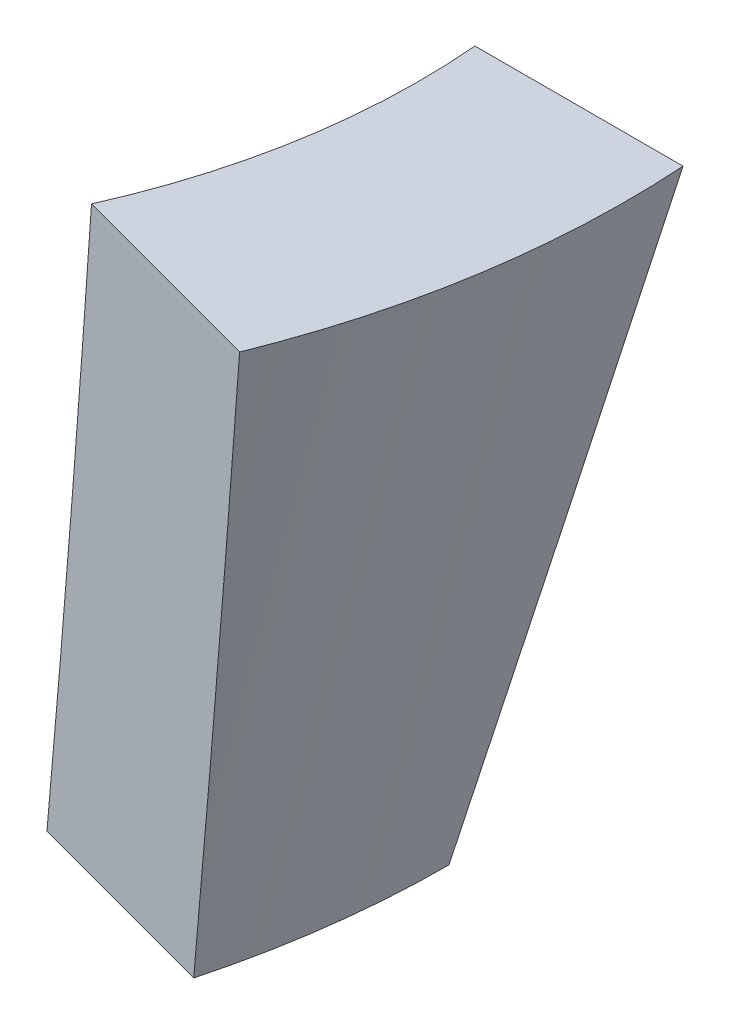
ISO-10303-21;
HEADER;
FILE_DESCRIPTION(('STEP AP214'),'2;1');
FILE_NAME('part.step','',(''),(''),'','','');
FILE_SCHEMA(('AUTOMOTIVE_DESIGN { 1 0 10303 214 1 1 1 1 }'));
ENDSEC;
DATA;
#1=APPLICATION_CONTEXT('core data for automotive mechanical design processes');
#2=APPLICATION_PROTOCOL_DEFINITION('international standard','automotive_design',2000,#1);
#3=PRODUCT_CONTEXT('',#1,'mechanical');
#4=PRODUCT('Part','Part','',(#3));
#5=PRODUCT_RELATED_PRODUCT_CATEGORY('part','',(#4));
#6=PRODUCT_DEFINITION_FORMATION('','',#4);
#7=PRODUCT_DEFINITION_CONTEXT('part definition',#1,'design');
#8=PRODUCT_DEFINITION('design','',#6,#7);
#9=PRODUCT_DEFINITION_SHAPE('','',#8);
#10=(LENGTH_UNIT() NAMED_UNIT(*) SI_UNIT(.MILLI.,.METRE.));
#11=(NAMED_UNIT(*) PLANE_ANGLE_UNIT() SI_UNIT($,.RADIAN.));
#12=(NAMED_UNIT(*) SI_UNIT($,.STERADIAN.) SOLID_ANGLE_UNIT());
#13=UNCERTAINTY_MEASURE_WITH_UNIT(LENGTH_MEASURE(1.E-05),#10,'distance_accuracy_value','');
#14=(GEOMETRIC_REPRESENTATION_CONTEXT(3) GLOBAL_UNCERTAINTY_ASSIGNED_CONTEXT((#13)) GLOBAL_UNIT_ASSIGNED_CONTEXT((#10,
#11,#12)) REPRESENTATION_CONTEXT('',''));
#15=CARTESIAN_POINT('',(0.,0.,0.));
#16=DIRECTION('',(0.,0.,1.));
#17=DIRECTION('',(1.,0.,0.));
#18=AXIS2_PLACEMENT_3D('',#15,#16,#17);
#19=CARTESIAN_POINT('',(21.4359353944896,80.,0.));
#20=DIRECTION('',(0.,1.,0.));
#21=DIRECTION('',(0.,0.,-1.));
#22=AXIS2_PLACEMENT_3D('',#19,#20,#21);
#23=CIRCLE('',#22,105.);
#24=DIRECTION('',(-0.258819045102518,-0.965925826289069,0.));
#25=VECTOR('',#24,1.);
#26=SURFACE_OF_LINEAR_EXTRUSION('',#23,#25);
#27=CARTESIAN_POINT('',(0.,0.,0.));
#28=DIRECTION('',(0.,1.,0.));
#29=DIRECTION('',(0.,0.,-1.));
#30=AXIS2_PLACEMENT_3D('',#27,#28,#29);
#31=CIRCLE('',#30,105.);
#32=CARTESIAN_POINT('',(101.422211760352,0.,27.1759997357646));
#33=VERTEX_POINT('',#32);
#34=CARTESIAN_POINT('',(105.,0.,0.));
#35=VERTEX_POINT('',#34);
#36=EDGE_CURVE('E100',#33,#35,#31,.T.);
#37=ORIENTED_EDGE('',*,*,#36,.T.);
#38=CARTESIAN_POINT('',(284.996412712619,760.461821769923,-66.5317884491401));
#39=CARTESIAN_POINT('',(283.950627110963,755.134162214118,-66.0656786348816));
#40=CARTESIAN_POINT('',(282.898399691684,749.807760474275,-65.5996788652606));
#41=CARTESIAN_POINT('',(280.781574157371,739.157399931895,-64.6678930553385));
#42=CARTESIAN_POINT('',(279.716976049185,733.833441128007,-64.2021070149193));
#43=CARTESIAN_POINT('',(276.505400993526,717.865149228456,-62.8050624978357));
#44=CARTESIAN_POINT('',(274.340635842155,707.224362613781,-61.8741142980533));
#45=CARTESIAN_POINT('',(269.967615093084,685.953872973423,-60.0131875868763));
#46=CARTESIAN_POINT('',(267.759368219562,675.324168165986,-59.0832089195986));
#47=CARTESIAN_POINT('',(263.3019218374,654.073275511207,-57.2239967224991));
#48=CARTESIAN_POINT('',(261.052722291262,643.452087671673,-56.2947631933605));
#49=CARTESIAN_POINT('',(256.516202763636,622.219239788182,-54.4371297091846));
#50=CARTESIAN_POINT('',(254.228887772484,611.607578685693,-53.5087296615378));
#51=CARTESIAN_POINT('',(249.618035021354,590.392068279631,-51.6526130100911));
#52=CARTESIAN_POINT('',(247.294497251187,579.788218978256,-50.7248964064835));
#53=CARTESIAN_POINT('',(242.613281388418,558.588898372392,-48.8701961790189));
#54=CARTESIAN_POINT('',(240.255606058711,547.993426462278,-47.9432125021765));
#55=CARTESIAN_POINT('',(235.507581734488,526.809751183298,-46.0898810634514));
#56=CARTESIAN_POINT('',(233.117232737602,516.221547814959,-45.1635333016147));
#57=CARTESIAN_POINT('',(228.305412509121,495.052659367242,-43.3114955429946));
#58=CARTESIAN_POINT('',(225.883942670744,484.471973973524,-42.3858055187099));
#59=CARTESIAN_POINT('',(221.011042314298,463.317448370055,-40.5350243461375));
#60=CARTESIAN_POINT('',(218.559611782506,452.743608163442,-39.6099331981242));
#61=CARTESIAN_POINT('',(213.627949943281,431.602785230563,-37.7603508538885));
#62=CARTESIAN_POINT('',(211.147719126793,421.035802390637,-36.8358596477219));
#63=CARTESIAN_POINT('',(206.159393330158,399.908364183198,-34.9874483152265));
#64=CARTESIAN_POINT('',(203.651298338163,389.347908818463,-34.0635281891407));
#65=CARTESIAN_POINT('',(196.086820911852,357.677276472663,-31.2927068921858));
#66=CARTESIAN_POINT('',(190.989976296407,336.576677853738,-29.446643719419));
#67=CARTESIAN_POINT('',(180.693956923978,294.399353646874,-25.756605993461));
#68=CARTESIAN_POINT('',(175.494777882414,273.322629097744,-23.9126315311535));
#69=CARTESIAN_POINT('',(164.998344188185,231.191964043945,-20.2266759521383));
#70=CARTESIAN_POINT('',(159.701083111475,210.138025127931,-18.3846949744197));
#71=CARTESIAN_POINT('',(149.011677443429,168.05211772346,-14.7026551823268));
#72=CARTESIAN_POINT('',(143.619524657483,147.020151300289,-12.8625965486415));
#73=CARTESIAN_POINT('',(135.461954093145,115.488833974811,-10.1039637366235));
#74=CARTESIAN_POINT('',(132.731059530806,104.980607000741,-9.18461300263512));
#75=CARTESIAN_POINT('',(127.246452935855,83.9700618909327,-7.34642849102684));
#76=CARTESIAN_POINT('',(124.492740902851,73.4677437552953,-6.42759471341585));
#77=CARTESIAN_POINT('',(118.962330560816,52.4677191919843,-4.59033063036019));
#78=CARTESIAN_POINT('',(116.185629434018,41.9700135008218,-3.6719003893519));
#79=CARTESIAN_POINT('',(110.609690025781,20.9805446156968,-1.83555980847334));
#80=CARTESIAN_POINT('',(107.810451746198,10.4887814212452,-0.917649468560272));
#81=CARTESIAN_POINT('',(105.,0.,0.));
#82=B_SPLINE_CURVE_WITH_KNOTS('',3,(#38,#39,#40,#41,#42,#43,#44,#45,#46,#47,#48,#49,#50,#51,#52,
#53,#54,#55,#56,#57,#58,#59,#60,#61,#62,#63,#64,#65,#66,#67,#68,#69,#70,#71,#72,#73,#74,#75,#76,
#77,#78,#79,#80,#81),.UNSPECIFIED.,.F.,.F.,(4,2,2,2,2,2,2,2,2,2,2,2,2,2,2,2,2,2,2,2,2,4),(0.,
16.3478942096739,32.6957793677583,65.3914329823252,98.08059206673,130.769781084149,
163.454723320819,196.13967475127,228.821995477614,261.504318575239,294.185183612275,
326.866063618559,359.546387343826,392.22672496503,457.583827994663,522.943673267928,
588.307814641591,653.677628670979,686.366022147782,719.05441618468,751.746877958596,
784.439337041124),.UNSPECIFIED.);
#83=CARTESIAN_POINT('',(126.20240281622,80.,-6.99909308207394));
#84=VERTEX_POINT('',#83);
#85=EDGE_CURVE('E11',#84,#35,#82,.T.);
#86=ORIENTED_EDGE('',*,*,#85,.F.);
#87=CARTESIAN_POINT('',(118.883985968629,80.,39.100862385631));
#88=VERTEX_POINT('',#87);
#89=EDGE_CURVE('E120',#88,#84,#23,.T.);
#90=ORIENTED_EDGE('',*,*,#89,.F.);
#91=CARTESIAN_POINT('',(118.883985968629,80.,39.100862385631));
#92=CARTESIAN_POINT('',(118.325095594337,77.3274521465327,38.7090423280245));
#93=CARTESIAN_POINT('',(117.763849538037,74.6554818422243,38.3166433788007));
#94=CARTESIAN_POINT('',(116.636678776635,69.3127328607252,37.530699771727));
#95=CARTESIAN_POINT('',(116.070754130813,66.6419541688869,37.1371551284345));
#96=CARTESIAN_POINT('',(114.93425011342,61.3015824603678,36.3489260042872));
#97=CARTESIAN_POINT('',(114.363670785723,58.6319894327602,35.9542415341993));
#98=CARTESIAN_POINT('',(113.217878535411,53.2939837590395,35.1637379389771));
#99=CARTESIAN_POINT('',(112.642665641666,50.6255711056806,34.7679188209227));
#100=CARTESIAN_POINT('',(111.487625399766,45.2899213950624,33.9751506250148));
#101=CARTESIAN_POINT('',(110.907798065818,42.6226843342104,33.5782015506427));
#102=CARTESIAN_POINT('',(109.743546053381,37.2893821195691,32.783177692541));
#103=CARTESIAN_POINT('',(109.159121375691,34.6233169655759,32.3851029090072));
#104=CARTESIAN_POINT('',(107.985689455567,29.2923540935908,31.5878311878498));
#105=CARTESIAN_POINT('',(107.396682198536,26.6274563793456,31.1886342466549));
#106=CARTESIAN_POINT('',(106.214097953585,21.2988250523751,30.3891213469766));
#107=CARTESIAN_POINT('',(105.620520936937,18.6350914470791,29.9888053814687));
#108=CARTESIAN_POINT('',(104.428808138554,13.3087854913733,29.1870571136083));
#109=CARTESIAN_POINT('',(103.830672314145,10.6462131520807,28.7856248008286));
#110=CARTESIAN_POINT('',(102.62985036912,5.32222751902937,27.9816459075423));
#111=CARTESIAN_POINT('',(102.027164192021,2.66081424009271,27.579099313244));
#112=CARTESIAN_POINT('',(101.422211760352,0.,27.1759997357647));
#113=B_SPLINE_CURVE_WITH_KNOTS('',3,(#91,#92,#93,#94,#95,#96,#97,#98,#99,#100,#101,#102,#103,
#104,#105,#106,#107,#108,#109,#110,#111,#112),.UNSPECIFIED.,.F.,.F.,(4,2,2,2,2,2,2,2,2,2,4),(0.,
8.27499371947538,16.5498827512979,24.8246938728032,33.09945347435,41.3741876100941,
49.6489203062983,57.923679367127,66.1984904884286,74.4733791609675,82.7483707152484),.UNSPECIFIED.);
#114=EDGE_CURVE('E107',#88,#33,#113,.T.);
#115=ORIENTED_EDGE('',*,*,#114,.T.);
#116=EDGE_LOOP('',(#37,#86,#90,#115));
#117=FACE_BOUND('',#116,.T.);
#118=ADVANCED_FACE('F44',(#117),#26,.F.);
#119=CARTESIAN_POINT('',(80.,0.,0.));
#120=DIRECTION('',(0.,-0.0871557427476584,-0.996194698091746));
#121=DIRECTION('',(0.,0.996194698091746,-0.0871557427476584));
#122=AXIS2_PLACEMENT_3D('',#119,#120,#121);
#123=PLANE('',#122);
#124=DIRECTION('',(-1.,0.,0.));
#125=VECTOR('',#124,1.);
#126=CARTESIAN_POINT('',(80.,0.,0.));
#127=LINE('',#126,#125);
#128=CARTESIAN_POINT('',(80.,0.,0.));
#129=VERTEX_POINT('',#128);
#130=EDGE_CURVE('E97',#35,#129,#127,.T.);
#131=ORIENTED_EDGE('',*,*,#130,.T.);
#132=CARTESIAN_POINT('',(101.129176613733,80.,-6.99909308207394));
#133=CARTESIAN_POINT('',(100.260806774325,76.6635234195996,-6.70718920516916));
#134=CARTESIAN_POINT('',(99.3909229710173,73.3274378887218,-6.41531954066449));
#135=CARTESIAN_POINT('',(97.6481396684642,66.6560572228062,-5.83164936233084));
#136=CARTESIAN_POINT('',(96.7752401764913,63.320762085883,-5.53984884833692));
#137=CARTESIAN_POINT('',(95.026434941116,56.650959755807,-4.95631675649647));
#138=CARTESIAN_POINT('',(94.1505292025223,53.316452561403,-4.66458517854049));
#139=CARTESIAN_POINT('',(92.3957194853498,46.6482240293872,-4.08119077618899));
#140=CARTESIAN_POINT('',(91.5168155091545,43.314502691153,-3.78952795173902));
#141=CARTESIAN_POINT('',(89.7560163186069,36.6478441078453,-3.2062709021018));
#142=CARTESIAN_POINT('',(88.8741211042932,33.3149068627617,-2.91467667691366));
#143=CARTESIAN_POINT('',(87.1073452625483,26.649814863093,-2.33155668558532));
#144=CARTESIAN_POINT('',(86.2224646327143,23.31766010914,-2.04003091950042));
#145=CARTESIAN_POINT('',(84.4497227957392,16.6541318148088,-1.4570477346622));
#146=CARTESIAN_POINT('',(83.5618615838298,13.3227582756896,-1.16559031601903));
#147=CARTESIAN_POINT('',(81.7831620532995,6.66079149234739,-0.58274374569032));
#148=CARTESIAN_POINT('',(80.8923237275605,3.33019825001051,-0.291354594169793));
#149=CARTESIAN_POINT('',(80.,0.,0.));
#150=B_SPLINE_CURVE_WITH_KNOTS('',3,(#132,#133,#134,#135,#136,#137,#138,#139,#140,#141,#142,
#143,#144,#145,#146,#147,#148,#149),.UNSPECIFIED.,.F.,.F.,(4,2,2,2,2,2,2,2,4),(0.,
10.3798912600029,20.7597575059986,31.1396071562676,41.5194485569093,51.899289823932,
62.279139447435,72.6590056845541,83.038896757264),.UNSPECIFIED.);
#151=CARTESIAN_POINT('',(101.129176613733,80.,-6.99909308207394));
#152=VERTEX_POINT('',#151);
#153=EDGE_CURVE('E49',#152,#129,#150,.T.);
#154=ORIENTED_EDGE('',*,*,#153,.F.);
#155=DIRECTION('',(1.,0.,0.));
#156=VECTOR('',#155,1.);
#157=CARTESIAN_POINT('',(21.4359353944896,80.,-6.99909308207394));
#158=LINE('',#157,#156);
#159=EDGE_CURVE('E78',#84,#152,#158,.F.);
#160=ORIENTED_EDGE('',*,*,#159,.F.);
#161=ORIENTED_EDGE('',*,*,#85,.T.);
#162=EDGE_LOOP('',(#131,#154,#160,#161));
#163=FACE_BOUND('',#162,.T.);
#164=ADVANCED_FACE('F46',(#163),#123,.T.);
#165=CARTESIAN_POINT('',(21.4359353944896,80.,0.));
#166=DIRECTION('',(0.,-1.,0.));
#167=DIRECTION('',(0.,0.,-1.));
#168=AXIS2_PLACEMENT_3D('',#165,#166,#167);
#169=CIRCLE('',#168,80.);
#170=DIRECTION('',(-0.258819045102518,-0.965925826289069,0.));
#171=VECTOR('',#170,1.);
#172=SURFACE_OF_LINEAR_EXTRUSION('',#169,#171);
#173=CARTESIAN_POINT('',(0.,0.,0.));
#174=DIRECTION('',(0.,-1.,0.));
#175=DIRECTION('',(0.,0.,-1.));
#176=AXIS2_PLACEMENT_3D('',#173,#174,#175);
#177=CIRCLE('',#176,80.);
#178=CARTESIAN_POINT('',(77.2740661031255,0.,20.7055236082016));
#179=VERTEX_POINT('',#178);
#180=EDGE_CURVE('E101',#129,#179,#177,.T.);
#181=ORIENTED_EDGE('',*,*,#180,.T.);
#182=CARTESIAN_POINT('',(77.2740661031254,0.,20.7055236082016));
#183=CARTESIAN_POINT('',(78.1839010807615,4.00182156292017,21.3117778612549));
#184=CARTESIAN_POINT('',(79.0870138170806,8.00542021593726,21.916391854986));
#185=CARTESIAN_POINT('',(80.8796622368462,16.0158850226615,23.1222778357399));
#186=CARTESIAN_POINT('',(81.7691987822522,20.0227509517687,23.7235500333807));
#187=CARTESIAN_POINT('',(83.5346325466569,28.0397662212163,24.9227371769071));
#188=CARTESIAN_POINT('',(84.4105304699857,32.0499153806702,25.5206522951333));
#189=CARTESIAN_POINT('',(86.1485951966325,40.0735203637037,26.7131027899376));
#190=CARTESIAN_POINT('',(87.0107625434088,44.0869760497646,27.3076382996791));
#191=CARTESIAN_POINT('',(88.7212516446338,52.1172231165476,28.4933015341875));
#192=CARTESIAN_POINT('',(89.5695737759243,56.1340144033429,29.0844293514216));
#193=CARTESIAN_POINT('',(91.2522322456502,64.1709682077026,30.2632428529775));
#194=CARTESIAN_POINT('',(92.0865687863851,68.1911306756186,30.8509285870085));
#195=CARTESIAN_POINT('',(93.7410945971078,76.2348940273241,32.0228207395738));
#196=CARTESIAN_POINT('',(94.5612837965675,80.2584949281502,32.6070271407531));
#197=CARTESIAN_POINT('',(96.1873143443664,88.3091570696587,33.7719088680292));
#198=CARTESIAN_POINT('',(96.9931555205763,92.3362183512476,34.3525841517091));
#199=CARTESIAN_POINT('',(98.5902646171318,100.39385309712,35.5103479426285));
#200=CARTESIAN_POINT('',(99.38153216872,104.424426647579,36.0874363588652));
#201=CARTESIAN_POINT('',(100.94923569614,112.489145250806,37.2379625711617));
#202=CARTESIAN_POINT('',(101.725671089319,116.523290437393,37.8114002232208));
#203=CARTESIAN_POINT('',(103.263420235999,124.595219273575,38.954553249729));
#204=CARTESIAN_POINT('',(104.024733171736,128.633003107659,39.5242684217691));
#205=CARTESIAN_POINT('',(105.531898637839,136.712286130774,40.6598926807274));
#206=CARTESIAN_POINT('',(106.277750088357,140.753785558857,41.2258014999536));
#207=CARTESIAN_POINT('',(107.01566993384,144.797008813451,41.7897411874805));
#208=B_SPLINE_CURVE_WITH_KNOTS('',3,(#182,#183,#184,#185,#186,#187,#188,#189,#190,#191,#192,
#193,#194,#195,#196,#197,#198,#199,#200,#201,#202,#203,#204,#205,#206,#207),.UNSPECIFIED.,.F.,
.F.,(4,2,2,2,2,2,2,2,2,2,2,2,4),(0.,12.4454463009908,24.8900991192894,37.3341071210813,
49.7776213569531,62.2207963361362,74.6637911709448,87.1068480193207,99.5500540432086,
111.993574486864,124.437582748972,136.88226211209,149.327807716477),.UNSPECIFIED.);
#209=CARTESIAN_POINT('',(94.5062376457675,80.,32.5688644092312));
#210=VERTEX_POINT('',#209);
#211=EDGE_CURVE('E121',#210,#179,#208,.F.);
#212=ORIENTED_EDGE('',*,*,#211,.F.);
#213=EDGE_CURVE('E114',#152,#210,#169,.T.);
#214=ORIENTED_EDGE('',*,*,#213,.F.);
#215=ORIENTED_EDGE('',*,*,#153,.T.);
#216=EDGE_LOOP('',(#181,#212,#214,#215));
#217=FACE_BOUND('',#216,.T.);
#218=ADVANCED_FACE('F128',(#217),#172,.F.);
#219=CARTESIAN_POINT('',(77.2740661031255,0.,20.7055236082016));
#220=DIRECTION('',(-0.257834160496299,-0.0871557427476584,0.962250186899059));
#221=DIRECTION('',(0.965925826289069,0.,0.25881904510252));
#222=AXIS2_PLACEMENT_3D('',#219,#220,#221);
#223=PLANE('',#222);
#224=DIRECTION('',(0.965925826289069,0.,0.25881904510252));
#225=VECTOR('',#224,1.);
#226=CARTESIAN_POINT('',(77.2740661031255,0.,20.7055236082016));
#227=LINE('',#226,#225);
#228=EDGE_CURVE('E84',#179,#33,#227,.T.);
#229=ORIENTED_EDGE('',*,*,#228,.T.);
#230=ORIENTED_EDGE('',*,*,#114,.F.);
#231=DIRECTION('',(-0.965925826289069,0.,-0.25881904510252));
#232=VECTOR('',#231,1.);
#233=CARTESIAN_POINT('',(18.1885014119137,80.,12.1195886171988));
#234=LINE('',#233,#232);
#235=EDGE_CURVE('E68',#210,#88,#234,.F.);
#236=ORIENTED_EDGE('',*,*,#235,.F.);
#237=ORIENTED_EDGE('',*,*,#211,.T.);
#238=EDGE_LOOP('',(#229,#230,#236,#237));
#239=FACE_BOUND('',#238,.T.);
#240=ADVANCED_FACE('F132',(#239),#223,.T.);
#241=CARTESIAN_POINT('',(21.4359353944896,80.,0.));
#242=DIRECTION('',(0.,-1.,0.));
#243=DIRECTION('',(0.,0.,-1.));
#244=AXIS2_PLACEMENT_3D('',#241,#242,#243);
#245=PLANE('',#244);
#246=ORIENTED_EDGE('',*,*,#89,.T.);
#247=ORIENTED_EDGE('',*,*,#159,.T.);
#248=ORIENTED_EDGE('',*,*,#213,.T.);
#249=ORIENTED_EDGE('',*,*,#235,.T.);
#250=EDGE_LOOP('',(#246,#247,#248,#249));
#251=FACE_BOUND('',#250,.T.);
#252=ADVANCED_FACE('F135',(#251),#245,.F.);
#253=CARTESIAN_POINT('',(0.,0.,0.));
#254=DIRECTION('',(0.,-1.,0.));
#255=DIRECTION('',(0.,0.,-1.));
#256=AXIS2_PLACEMENT_3D('',#253,#254,#255);
#257=PLANE('',#256);
#258=CARTESIAN_POINT('',(91.7086496770774,0.,12.0736727803547));
#259=DIRECTION('',(0.,-1.,0.));
#260=DIRECTION('',(0.,0.,-1.));
#261=AXIS2_PLACEMENT_3D('',#258,#259,#260);
#262=CIRCLE('',#261,5.);
#263=CARTESIAN_POINT('',(91.7086496770774,0.,7.07367278035474));
#264=VERTEX_POINT('',#263);
#265=EDGE_CURVE('E111',#264,#264,#262,.T.);
#266=ORIENTED_EDGE('',*,*,#265,.F.);
#267=EDGE_LOOP('',(#266));
#268=FACE_BOUND('',#267,.T.);
#269=ORIENTED_EDGE('',*,*,#36,.F.);
#270=ORIENTED_EDGE('',*,*,#228,.F.);
#271=ORIENTED_EDGE('',*,*,#180,.F.);
#272=ORIENTED_EDGE('',*,*,#130,.F.);
#273=EDGE_LOOP('',(#269,#270,#271,#272));
#274=FACE_BOUND('',#273,.T.);
#275=ADVANCED_FACE('F98',(#268,#274),#257,.T.);
#276=CARTESIAN_POINT('',(91.7086496770774,25.,12.0736727803547));
#277=DIRECTION('',(0.,-1.,0.));
#278=DIRECTION('',(0.,0.,-1.));
#279=AXIS2_PLACEMENT_3D('',#276,#277,#278);
#280=CYLINDRICAL_SURFACE('',#279,5.);
#281=CARTESIAN_POINT('',(91.7086496770774,25.,12.0736727803547));
#282=DIRECTION('',(0.,-1.,0.));
#283=DIRECTION('',(0.,0.,-1.));
#284=AXIS2_PLACEMENT_3D('',#281,#282,#283);
#285=CIRCLE('',#284,5.);
#286=CARTESIAN_POINT('',(91.7086496770774,25.,7.07367278035474));
#287=VERTEX_POINT('',#286);
#288=EDGE_CURVE('E108',#287,#287,#285,.T.);
#289=ORIENTED_EDGE('',*,*,#288,.F.);
#290=EDGE_LOOP('',(#289));
#291=FACE_BOUND('',#290,.T.);
#292=ORIENTED_EDGE('',*,*,#265,.T.);
#293=EDGE_LOOP('',(#292));
#294=FACE_BOUND('',#293,.T.);
#295=ADVANCED_FACE('F151',(#291,#294),#280,.F.);
#296=CARTESIAN_POINT('',(91.7086496770774,25.,12.0736727803547));
#297=DIRECTION('',(0.,-1.,0.));
#298=DIRECTION('',(0.,0.,-1.));
#299=AXIS2_PLACEMENT_3D('',#296,#297,#298);
#300=PLANE('',#299);
#301=ORIENTED_EDGE('',*,*,#288,.T.);
#302=EDGE_LOOP('',(#301));
#303=FACE_BOUND('',#302,.T.);
#304=ADVANCED_FACE('F158',(#303),#300,.T.);
#305=CLOSED_SHELL('',(#118,#164,#218,#240,#252,#275,#295,#304));
#306=MANIFOLD_SOLID_BREP('B2',#305);
#307=ADVANCED_BREP_SHAPE_REPRESENTATION('',(#18,#306),#14);
#308=SHAPE_DEFINITION_REPRESENTATION(#9,#307);
ENDSEC;
END-ISO-10303-21;
